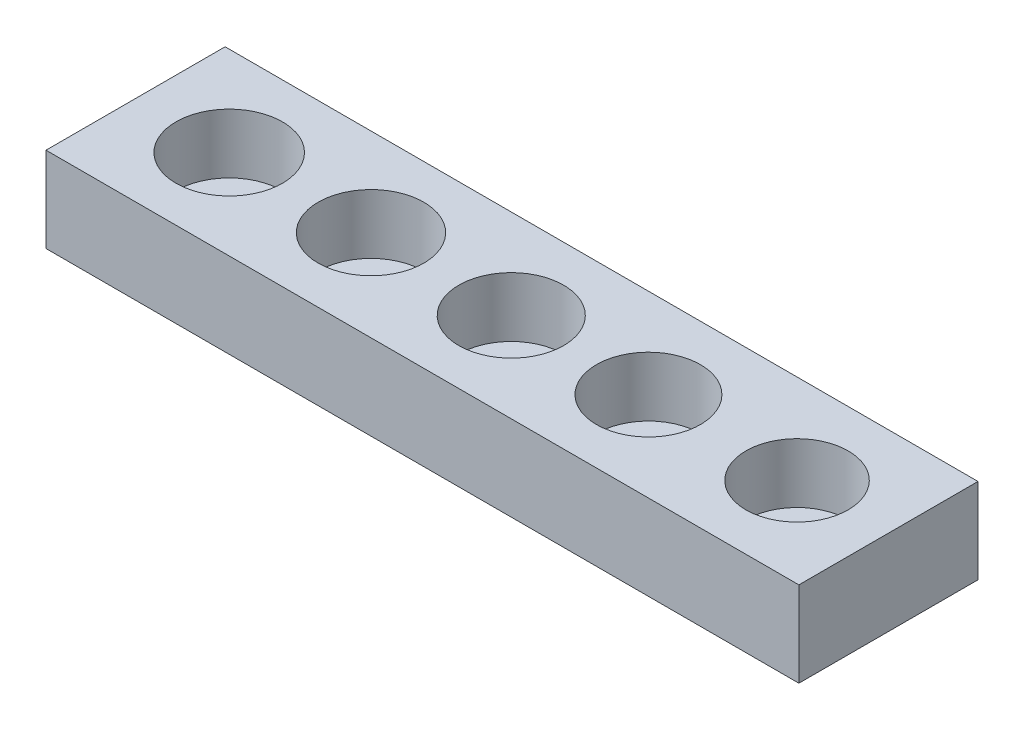
ISO-10303-21;
HEADER;
FILE_DESCRIPTION(('STEP AP214'),'2;1');
FILE_NAME('part.step','',(''),(''),'','','');
FILE_SCHEMA(('AUTOMOTIVE_DESIGN { 1 0 10303 214 1 1 1 1 }'));
ENDSEC;
DATA;
#1=APPLICATION_CONTEXT('core data for automotive mechanical design processes');
#2=APPLICATION_PROTOCOL_DEFINITION('international standard','automotive_design',2000,#1);
#3=PRODUCT_CONTEXT('',#1,'mechanical');
#4=PRODUCT('Part','Part','',(#3));
#5=PRODUCT_RELATED_PRODUCT_CATEGORY('part','',(#4));
#6=PRODUCT_DEFINITION_FORMATION('','',#4);
#7=PRODUCT_DEFINITION_CONTEXT('part definition',#1,'design');
#8=PRODUCT_DEFINITION('design','',#6,#7);
#9=PRODUCT_DEFINITION_SHAPE('','',#8);
#10=(LENGTH_UNIT() NAMED_UNIT(*) SI_UNIT(.MILLI.,.METRE.));
#11=(NAMED_UNIT(*) PLANE_ANGLE_UNIT() SI_UNIT($,.RADIAN.));
#12=(NAMED_UNIT(*) SI_UNIT($,.STERADIAN.) SOLID_ANGLE_UNIT());
#13=UNCERTAINTY_MEASURE_WITH_UNIT(LENGTH_MEASURE(1.E-05),#10,'distance_accuracy_value','');
#14=(GEOMETRIC_REPRESENTATION_CONTEXT(3) GLOBAL_UNCERTAINTY_ASSIGNED_CONTEXT((#13)) GLOBAL_UNIT_ASSIGNED_CONTEXT((#10,
#11,#12)) REPRESENTATION_CONTEXT('',''));
#15=CARTESIAN_POINT('',(0.,0.,0.));
#16=DIRECTION('',(0.,0.,1.));
#17=DIRECTION('',(1.,0.,0.));
#18=AXIS2_PLACEMENT_3D('',#15,#16,#17);
#19=CARTESIAN_POINT('',(-22.0918953244975,5.,-5.25584062481323));
#20=DIRECTION('',(0.,0.,-1.));
#21=DIRECTION('',(-1.,0.,0.));
#22=AXIS2_PLACEMENT_3D('',#19,#20,#21);
#23=PLANE('',#22);
#24=DIRECTION('',(1.,0.,0.));
#25=VECTOR('',#24,1.);
#26=CARTESIAN_POINT('',(-22.0918953244975,0.,-5.25584062481323));
#27=LINE('',#26,#25);
#28=CARTESIAN_POINT('',(-22.0918953244975,0.,-5.25584062481323));
#29=VERTEX_POINT('',#28);
#30=CARTESIAN_POINT('',(22.0918953244975,0.,-5.25584062481323));
#31=VERTEX_POINT('',#30);
#32=EDGE_CURVE('E116',#29,#31,#27,.T.);
#33=ORIENTED_EDGE('',*,*,#32,.F.);
#34=DIRECTION('',(0.,-1.,0.));
#35=VECTOR('',#34,1.);
#36=CARTESIAN_POINT('',(-22.0918953244975,5.,-5.25584062481323));
#37=LINE('',#36,#35);
#38=CARTESIAN_POINT('',(-22.0918953244975,5.,-5.25584062481323));
#39=VERTEX_POINT('',#38);
#40=EDGE_CURVE('E11',#39,#29,#37,.T.);
#41=ORIENTED_EDGE('',*,*,#40,.F.);
#42=DIRECTION('',(1.,0.,0.));
#43=VECTOR('',#42,1.);
#44=CARTESIAN_POINT('',(-22.0918953244975,5.,-5.25584062481323));
#45=LINE('',#44,#43);
#46=CARTESIAN_POINT('',(22.0918953244975,5.,-5.25584062481323));
#47=VERTEX_POINT('',#46);
#48=EDGE_CURVE('E107',#39,#47,#45,.T.);
#49=ORIENTED_EDGE('',*,*,#48,.T.);
#50=DIRECTION('',(0.,-1.,0.));
#51=VECTOR('',#50,1.);
#52=CARTESIAN_POINT('',(22.0918953244975,5.,-5.25584062481323));
#53=LINE('',#52,#51);
#54=EDGE_CURVE('E48',#47,#31,#53,.T.);
#55=ORIENTED_EDGE('',*,*,#54,.T.);
#56=EDGE_LOOP('',(#33,#41,#49,#55));
#57=FACE_BOUND('',#56,.T.);
#58=ADVANCED_FACE('F45',(#57),#23,.T.);
#59=CARTESIAN_POINT('',(-22.0918953244975,5.,5.25584062481323));
#60=DIRECTION('',(-1.,0.,0.));
#61=DIRECTION('',(0.,0.,1.));
#62=AXIS2_PLACEMENT_3D('',#59,#60,#61);
#63=PLANE('',#62);
#64=DIRECTION('',(0.,0.,-1.));
#65=VECTOR('',#64,1.);
#66=CARTESIAN_POINT('',(-22.0918953244975,0.,5.25584062481323));
#67=LINE('',#66,#65);
#68=CARTESIAN_POINT('',(-22.0918953244975,0.,5.25584062481323));
#69=VERTEX_POINT('',#68);
#70=EDGE_CURVE('E110',#69,#29,#67,.T.);
#71=ORIENTED_EDGE('',*,*,#70,.F.);
#72=DIRECTION('',(0.,-1.,0.));
#73=VECTOR('',#72,1.);
#74=CARTESIAN_POINT('',(-22.0918953244975,5.,5.25584062481323));
#75=LINE('',#74,#73);
#76=CARTESIAN_POINT('',(-22.0918953244975,5.,5.25584062481323));
#77=VERTEX_POINT('',#76);
#78=EDGE_CURVE('E55',#77,#69,#75,.T.);
#79=ORIENTED_EDGE('',*,*,#78,.F.);
#80=DIRECTION('',(0.,0.,-1.));
#81=VECTOR('',#80,1.);
#82=CARTESIAN_POINT('',(-22.0918953244975,5.,5.25584062481323));
#83=LINE('',#82,#81);
#84=EDGE_CURVE('E94',#77,#39,#83,.T.);
#85=ORIENTED_EDGE('',*,*,#84,.T.);
#86=ORIENTED_EDGE('',*,*,#40,.T.);
#87=EDGE_LOOP('',(#71,#79,#85,#86));
#88=FACE_BOUND('',#87,.T.);
#89=ADVANCED_FACE('F133',(#88),#63,.T.);
#90=CARTESIAN_POINT('',(-22.0918953244975,5.,5.25584062481323));
#91=DIRECTION('',(0.,0.,-1.));
#92=DIRECTION('',(-1.,0.,0.));
#93=AXIS2_PLACEMENT_3D('',#90,#91,#92);
#94=PLANE('',#93);
#95=DIRECTION('',(1.,0.,0.));
#96=VECTOR('',#95,1.);
#97=CARTESIAN_POINT('',(-22.0918953244975,0.,5.25584062481323));
#98=LINE('',#97,#96);
#99=CARTESIAN_POINT('',(22.0918953244975,0.,5.25584062481323));
#100=VERTEX_POINT('',#99);
#101=EDGE_CURVE('E100',#69,#100,#98,.T.);
#102=ORIENTED_EDGE('',*,*,#101,.T.);
#103=DIRECTION('',(0.,-1.,0.));
#104=VECTOR('',#103,1.);
#105=CARTESIAN_POINT('',(22.0918953244975,5.,5.25584062481323));
#106=LINE('',#105,#104);
#107=CARTESIAN_POINT('',(22.0918953244975,5.,5.25584062481323));
#108=VERTEX_POINT('',#107);
#109=EDGE_CURVE('E98',#108,#100,#106,.T.);
#110=ORIENTED_EDGE('',*,*,#109,.F.);
#111=DIRECTION('',(1.,0.,0.));
#112=VECTOR('',#111,1.);
#113=CARTESIAN_POINT('',(-22.0918953244975,5.,5.25584062481323));
#114=LINE('',#113,#112);
#115=EDGE_CURVE('E91',#77,#108,#114,.T.);
#116=ORIENTED_EDGE('',*,*,#115,.F.);
#117=ORIENTED_EDGE('',*,*,#78,.T.);
#118=EDGE_LOOP('',(#102,#110,#116,#117));
#119=FACE_BOUND('',#118,.T.);
#120=ADVANCED_FACE('F99',(#119),#94,.F.);
#121=CARTESIAN_POINT('',(22.0918953244975,5.,5.25584062481323));
#122=DIRECTION('',(-1.,0.,0.));
#123=DIRECTION('',(0.,0.,1.));
#124=AXIS2_PLACEMENT_3D('',#121,#122,#123);
#125=PLANE('',#124);
#126=DIRECTION('',(0.,0.,-1.));
#127=VECTOR('',#126,1.);
#128=CARTESIAN_POINT('',(22.0918953244975,0.,5.25584062481323));
#129=LINE('',#128,#127);
#130=EDGE_CURVE('E120',#100,#31,#129,.T.);
#131=ORIENTED_EDGE('',*,*,#130,.T.);
#132=ORIENTED_EDGE('',*,*,#54,.F.);
#133=DIRECTION('',(0.,0.,-1.));
#134=VECTOR('',#133,1.);
#135=CARTESIAN_POINT('',(22.0918953244975,5.,5.25584062481323));
#136=LINE('',#135,#134);
#137=EDGE_CURVE('E88',#108,#47,#136,.T.);
#138=ORIENTED_EDGE('',*,*,#137,.F.);
#139=ORIENTED_EDGE('',*,*,#109,.T.);
#140=EDGE_LOOP('',(#131,#132,#138,#139));
#141=FACE_BOUND('',#140,.T.);
#142=ADVANCED_FACE('F105',(#141),#125,.F.);
#143=CARTESIAN_POINT('',(0.,5.,0.));
#144=DIRECTION('',(0.,1.,0.));
#145=DIRECTION('',(0.,0.,1.));
#146=AXIS2_PLACEMENT_3D('',#143,#144,#145);
#147=PLANE('',#146);
#148=CARTESIAN_POINT('',(-16.5953893403899,5.,0.));
#149=DIRECTION('',(0.,1.,0.));
#150=DIRECTION('',(0.,0.,1.));
#151=AXIS2_PLACEMENT_3D('',#148,#149,#150);
#152=CIRCLE('',#151,3.125);
#153=CARTESIAN_POINT('',(-16.5953893403899,5.,3.125));
#154=VERTEX_POINT('',#153);
#155=EDGE_CURVE('E198',#154,#154,#152,.T.);
#156=ORIENTED_EDGE('',*,*,#155,.F.);
#157=EDGE_LOOP('',(#156));
#158=FACE_BOUND('',#157,.T.);
#159=CARTESIAN_POINT('',(-8.36374721634367,5.,-0.0889760342164235));
#160=DIRECTION('',(0.,1.,0.));
#161=DIRECTION('',(0.,0.,1.));
#162=AXIS2_PLACEMENT_3D('',#159,#160,#161);
#163=CIRCLE('',#162,3.1);
#164=CARTESIAN_POINT('',(-8.36374721634367,5.,3.01102396578358));
#165=VERTEX_POINT('',#164);
#166=EDGE_CURVE('E202',#165,#165,#163,.T.);
#167=ORIENTED_EDGE('',*,*,#166,.F.);
#168=EDGE_LOOP('',(#167));
#169=FACE_BOUND('',#168,.T.);
#170=CARTESIAN_POINT('',(-0.044488017108206,5.,0.));
#171=DIRECTION('',(0.,1.,0.));
#172=DIRECTION('',(0.,0.,1.));
#173=AXIS2_PLACEMENT_3D('',#170,#171,#172);
#174=CIRCLE('',#173,3.075);
#175=CARTESIAN_POINT('',(-0.044488017108206,5.,3.075));
#176=VERTEX_POINT('',#175);
#177=EDGE_CURVE('E212',#176,#176,#174,.T.);
#178=ORIENTED_EDGE('',*,*,#177,.F.);
#179=EDGE_LOOP('',(#178));
#180=FACE_BOUND('',#179,.T.);
#181=CARTESIAN_POINT('',(8.00784307947799,5.,0.));
#182=DIRECTION('',(0.,1.,0.));
#183=DIRECTION('',(0.,0.,1.));
#184=AXIS2_PLACEMENT_3D('',#181,#182,#183);
#185=CIRCLE('',#184,3.05);
#186=CARTESIAN_POINT('',(8.00784307947799,5.,3.05));
#187=VERTEX_POINT('',#186);
#188=EDGE_CURVE('E220',#187,#187,#185,.T.);
#189=ORIENTED_EDGE('',*,*,#188,.F.);
#190=EDGE_LOOP('',(#189));
#191=FACE_BOUND('',#190,.T.);
#192=CARTESIAN_POINT('',(16.7274944326873,5.,0.));
#193=DIRECTION('',(0.,1.,0.));
#194=DIRECTION('',(0.,0.,1.));
#195=AXIS2_PLACEMENT_3D('',#192,#193,#194);
#196=CIRCLE('',#195,3.);
#197=CARTESIAN_POINT('',(16.7274944326873,5.,3.));
#198=VERTEX_POINT('',#197);
#199=EDGE_CURVE('E228',#198,#198,#196,.T.);
#200=ORIENTED_EDGE('',*,*,#199,.F.);
#201=EDGE_LOOP('',(#200));
#202=FACE_BOUND('',#201,.T.);
#203=ORIENTED_EDGE('',*,*,#48,.F.);
#204=ORIENTED_EDGE('',*,*,#84,.F.);
#205=ORIENTED_EDGE('',*,*,#115,.T.);
#206=ORIENTED_EDGE('',*,*,#137,.T.);
#207=EDGE_LOOP('',(#203,#204,#205,#206));
#208=FACE_BOUND('',#207,.T.);
#209=ADVANCED_FACE('F93',(#158,#169,#180,#191,#202,#208),#147,.T.);
#210=CARTESIAN_POINT('',(0.,0.,0.));
#211=DIRECTION('',(0.,1.,0.));
#212=DIRECTION('',(0.,0.,1.));
#213=AXIS2_PLACEMENT_3D('',#210,#211,#212);
#214=PLANE('',#213);
#215=ORIENTED_EDGE('',*,*,#32,.T.);
#216=ORIENTED_EDGE('',*,*,#130,.F.);
#217=ORIENTED_EDGE('',*,*,#101,.F.);
#218=ORIENTED_EDGE('',*,*,#70,.T.);
#219=EDGE_LOOP('',(#215,#216,#217,#218));
#220=FACE_BOUND('',#219,.T.);
#221=ADVANCED_FACE('F132',(#220),#214,.F.);
#222=CARTESIAN_POINT('',(16.7274944326873,1.5,0.));
#223=DIRECTION('',(0.,1.,0.));
#224=DIRECTION('',(0.,0.,1.));
#225=AXIS2_PLACEMENT_3D('',#222,#223,#224);
#226=CYLINDRICAL_SURFACE('',#225,3.);
#227=CARTESIAN_POINT('',(16.7274944326873,1.5,0.));
#228=DIRECTION('',(0.,1.,0.));
#229=DIRECTION('',(0.,0.,1.));
#230=AXIS2_PLACEMENT_3D('',#227,#228,#229);
#231=CIRCLE('',#230,3.);
#232=CARTESIAN_POINT('',(16.7274944326873,1.5,3.));
#233=VERTEX_POINT('',#232);
#234=EDGE_CURVE('E231',#233,#233,#231,.T.);
#235=ORIENTED_EDGE('',*,*,#234,.F.);
#236=EDGE_LOOP('',(#235));
#237=FACE_BOUND('',#236,.T.);
#238=ORIENTED_EDGE('',*,*,#199,.T.);
#239=EDGE_LOOP('',(#238));
#240=FACE_BOUND('',#239,.T.);
#241=ADVANCED_FACE('F152',(#237,#240),#226,.F.);
#242=CARTESIAN_POINT('',(16.7274944326873,1.5,0.));
#243=DIRECTION('',(0.,1.,0.));
#244=DIRECTION('',(0.,0.,1.));
#245=AXIS2_PLACEMENT_3D('',#242,#243,#244);
#246=PLANE('',#245);
#247=ORIENTED_EDGE('',*,*,#234,.T.);
#248=EDGE_LOOP('',(#247));
#249=FACE_BOUND('',#248,.T.);
#250=ADVANCED_FACE('F156',(#249),#246,.T.);
#251=CARTESIAN_POINT('',(8.00784307947799,1.5,0.));
#252=DIRECTION('',(0.,1.,0.));
#253=DIRECTION('',(0.,0.,1.));
#254=AXIS2_PLACEMENT_3D('',#251,#252,#253);
#255=CYLINDRICAL_SURFACE('',#254,3.05);
#256=CARTESIAN_POINT('',(8.00784307947799,1.5,0.));
#257=DIRECTION('',(0.,1.,0.));
#258=DIRECTION('',(0.,0.,1.));
#259=AXIS2_PLACEMENT_3D('',#256,#257,#258);
#260=CIRCLE('',#259,3.05);
#261=CARTESIAN_POINT('',(8.00784307947799,1.5,3.05));
#262=VERTEX_POINT('',#261);
#263=EDGE_CURVE('E224',#262,#262,#260,.T.);
#264=ORIENTED_EDGE('',*,*,#263,.F.);
#265=EDGE_LOOP('',(#264));
#266=FACE_BOUND('',#265,.T.);
#267=ORIENTED_EDGE('',*,*,#188,.T.);
#268=EDGE_LOOP('',(#267));
#269=FACE_BOUND('',#268,.T.);
#270=ADVANCED_FACE('F159',(#266,#269),#255,.F.);
#271=CARTESIAN_POINT('',(8.00784307947799,1.5,0.));
#272=DIRECTION('',(0.,1.,0.));
#273=DIRECTION('',(0.,0.,1.));
#274=AXIS2_PLACEMENT_3D('',#271,#272,#273);
#275=PLANE('',#274);
#276=ORIENTED_EDGE('',*,*,#263,.T.);
#277=EDGE_LOOP('',(#276));
#278=FACE_BOUND('',#277,.T.);
#279=ADVANCED_FACE('F163',(#278),#275,.T.);
#280=CARTESIAN_POINT('',(-0.044488017108206,1.5,0.));
#281=DIRECTION('',(0.,1.,0.));
#282=DIRECTION('',(0.,0.,1.));
#283=AXIS2_PLACEMENT_3D('',#280,#281,#282);
#284=CYLINDRICAL_SURFACE('',#283,3.075);
#285=CARTESIAN_POINT('',(-0.044488017108206,1.5,0.));
#286=DIRECTION('',(0.,1.,0.));
#287=DIRECTION('',(0.,0.,1.));
#288=AXIS2_PLACEMENT_3D('',#285,#286,#287);
#289=CIRCLE('',#288,3.075);
#290=CARTESIAN_POINT('',(-0.044488017108206,1.5,3.075));
#291=VERTEX_POINT('',#290);
#292=EDGE_CURVE('E216',#291,#291,#289,.T.);
#293=ORIENTED_EDGE('',*,*,#292,.F.);
#294=EDGE_LOOP('',(#293));
#295=FACE_BOUND('',#294,.T.);
#296=ORIENTED_EDGE('',*,*,#177,.T.);
#297=EDGE_LOOP('',(#296));
#298=FACE_BOUND('',#297,.T.);
#299=ADVANCED_FACE('F166',(#295,#298),#284,.F.);
#300=CARTESIAN_POINT('',(-0.044488017108206,1.5,0.));
#301=DIRECTION('',(0.,1.,0.));
#302=DIRECTION('',(0.,0.,1.));
#303=AXIS2_PLACEMENT_3D('',#300,#301,#302);
#304=PLANE('',#303);
#305=ORIENTED_EDGE('',*,*,#292,.T.);
#306=EDGE_LOOP('',(#305));
#307=FACE_BOUND('',#306,.T.);
#308=ADVANCED_FACE('F171',(#307),#304,.T.);
#309=CARTESIAN_POINT('',(-8.36374721634367,1.5,-0.0889760342164235));
#310=DIRECTION('',(0.,1.,0.));
#311=DIRECTION('',(0.,0.,1.));
#312=AXIS2_PLACEMENT_3D('',#309,#310,#311);
#313=CYLINDRICAL_SURFACE('',#312,3.1);
#314=CARTESIAN_POINT('',(-8.36374721634367,1.5,-0.0889760342164235));
#315=DIRECTION('',(0.,1.,0.));
#316=DIRECTION('',(0.,0.,1.));
#317=AXIS2_PLACEMENT_3D('',#314,#315,#316);
#318=CIRCLE('',#317,3.1);
#319=CARTESIAN_POINT('',(-8.36374721634367,1.5,3.01102396578358));
#320=VERTEX_POINT('',#319);
#321=EDGE_CURVE('E208',#320,#320,#318,.T.);
#322=ORIENTED_EDGE('',*,*,#321,.F.);
#323=EDGE_LOOP('',(#322));
#324=FACE_BOUND('',#323,.T.);
#325=ORIENTED_EDGE('',*,*,#166,.T.);
#326=EDGE_LOOP('',(#325));
#327=FACE_BOUND('',#326,.T.);
#328=ADVANCED_FACE('F174',(#324,#327),#313,.F.);
#329=CARTESIAN_POINT('',(-8.36374721634367,1.5,-0.0889760342164235));
#330=DIRECTION('',(0.,1.,0.));
#331=DIRECTION('',(0.,0.,1.));
#332=AXIS2_PLACEMENT_3D('',#329,#330,#331);
#333=PLANE('',#332);
#334=ORIENTED_EDGE('',*,*,#321,.T.);
#335=EDGE_LOOP('',(#334));
#336=FACE_BOUND('',#335,.T.);
#337=ADVANCED_FACE('F179',(#336),#333,.T.);
#338=CARTESIAN_POINT('',(-16.5953893403899,1.5,0.));
#339=DIRECTION('',(0.,1.,0.));
#340=DIRECTION('',(0.,0.,1.));
#341=AXIS2_PLACEMENT_3D('',#338,#339,#340);
#342=CYLINDRICAL_SURFACE('',#341,3.125);
#343=CARTESIAN_POINT('',(-16.5953893403899,1.5,0.));
#344=DIRECTION('',(0.,1.,0.));
#345=DIRECTION('',(0.,0.,1.));
#346=AXIS2_PLACEMENT_3D('',#343,#344,#345);
#347=CIRCLE('',#346,3.125);
#348=CARTESIAN_POINT('',(-16.5953893403899,1.5,3.125));
#349=VERTEX_POINT('',#348);
#350=EDGE_CURVE('E121',#349,#349,#347,.T.);
#351=ORIENTED_EDGE('',*,*,#350,.F.);
#352=EDGE_LOOP('',(#351));
#353=FACE_BOUND('',#352,.T.);
#354=ORIENTED_EDGE('',*,*,#155,.T.);
#355=EDGE_LOOP('',(#354));
#356=FACE_BOUND('',#355,.T.);
#357=ADVANCED_FACE('F182',(#353,#356),#342,.F.);
#358=CARTESIAN_POINT('',(-16.5953893403899,1.5,0.));
#359=DIRECTION('',(0.,1.,0.));
#360=DIRECTION('',(0.,0.,1.));
#361=AXIS2_PLACEMENT_3D('',#358,#359,#360);
#362=PLANE('',#361);
#363=ORIENTED_EDGE('',*,*,#350,.T.);
#364=EDGE_LOOP('',(#363));
#365=FACE_BOUND('',#364,.T.);
#366=ADVANCED_FACE('F189',(#365),#362,.T.);
#367=CLOSED_SHELL('',(#58,#89,#120,#142,#209,#221,#241,#250,#270,#279,#299,#308,#328,#337,#357,#366));
#368=MANIFOLD_SOLID_BREP('B2',#367);
#369=ADVANCED_BREP_SHAPE_REPRESENTATION('',(#18,#368),#14);
#370=SHAPE_DEFINITION_REPRESENTATION(#9,#369);
ENDSEC;
END-ISO-10303-21;
